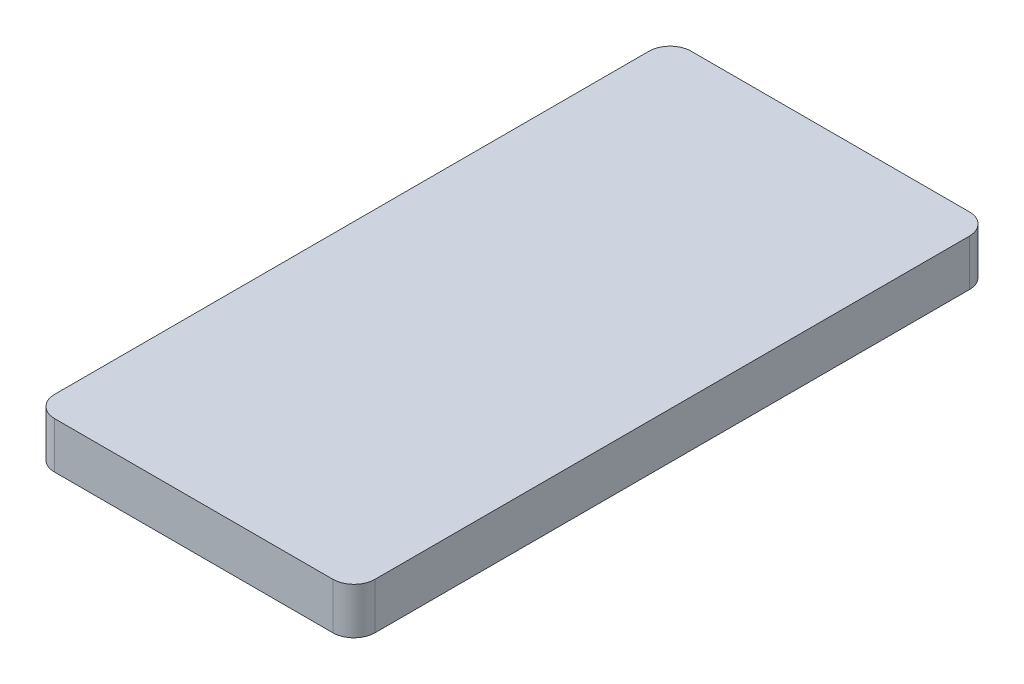
ISO-10303-21;
HEADER;
FILE_DESCRIPTION(('STEP AP214'),'2;1');
FILE_NAME('part.step','',(''),(''),'','','');
FILE_SCHEMA(('AUTOMOTIVE_DESIGN { 1 0 10303 214 1 1 1 1 }'));
ENDSEC;
DATA;
#1=APPLICATION_CONTEXT('core data for automotive mechanical design processes');
#2=APPLICATION_PROTOCOL_DEFINITION('international standard','automotive_design',2000,#1);
#3=PRODUCT_CONTEXT('',#1,'mechanical');
#4=PRODUCT('Part','Part','',(#3));
#5=PRODUCT_RELATED_PRODUCT_CATEGORY('part','',(#4));
#6=PRODUCT_DEFINITION_FORMATION('','',#4);
#7=PRODUCT_DEFINITION_CONTEXT('part definition',#1,'design');
#8=PRODUCT_DEFINITION('design','',#6,#7);
#9=PRODUCT_DEFINITION_SHAPE('','',#8);
#10=(LENGTH_UNIT() NAMED_UNIT(*) SI_UNIT(.MILLI.,.METRE.));
#11=(NAMED_UNIT(*) PLANE_ANGLE_UNIT() SI_UNIT($,.RADIAN.));
#12=(NAMED_UNIT(*) SI_UNIT($,.STERADIAN.) SOLID_ANGLE_UNIT());
#13=UNCERTAINTY_MEASURE_WITH_UNIT(LENGTH_MEASURE(1.E-05),#10,'distance_accuracy_value','');
#14=(GEOMETRIC_REPRESENTATION_CONTEXT(3) GLOBAL_UNCERTAINTY_ASSIGNED_CONTEXT((#13)) GLOBAL_UNIT_ASSIGNED_CONTEXT((#10,
#11,#12)) REPRESENTATION_CONTEXT('',''));
#15=CARTESIAN_POINT('',(0.,0.,0.));
#16=DIRECTION('',(0.,0.,1.));
#17=DIRECTION('',(1.,0.,0.));
#18=AXIS2_PLACEMENT_3D('',#15,#16,#17);
#19=CARTESIAN_POINT('',(38.,11.,-75.5));
#20=DIRECTION('',(-1.,0.,0.));
#21=DIRECTION('',(0.,0.,1.));
#22=AXIS2_PLACEMENT_3D('',#19,#20,#21);
#23=PLANE('',#22);
#24=DIRECTION('',(0.,0.,-1.));
#25=VECTOR('',#24,1.);
#26=CARTESIAN_POINT('',(38.,0.,-75.5));
#27=LINE('',#26,#25);
#28=CARTESIAN_POINT('',(38.,0.,70.5));
#29=VERTEX_POINT('',#28);
#30=CARTESIAN_POINT('',(38.,0.,-70.5));
#31=VERTEX_POINT('',#30);
#32=EDGE_CURVE('E521',#29,#31,#27,.T.);
#33=ORIENTED_EDGE('',*,*,#32,.T.);
#34=DIRECTION('',(0.,-1.,0.));
#35=VECTOR('',#34,1.);
#36=CARTESIAN_POINT('',(38.,11.,-70.5));
#37=LINE('',#36,#35);
#38=CARTESIAN_POINT('',(38.,11.,-70.5));
#39=VERTEX_POINT('',#38);
#40=EDGE_CURVE('E13',#31,#39,#37,.F.);
#41=ORIENTED_EDGE('',*,*,#40,.T.);
#42=DIRECTION('',(0.,0.,-1.));
#43=VECTOR('',#42,1.);
#44=CARTESIAN_POINT('',(38.,11.,-75.5));
#45=LINE('',#44,#43);
#46=CARTESIAN_POINT('',(38.,11.,70.5));
#47=VERTEX_POINT('',#46);
#48=EDGE_CURVE('E538',#47,#39,#45,.T.);
#49=ORIENTED_EDGE('',*,*,#48,.F.);
#50=DIRECTION('',(0.,-1.,0.));
#51=VECTOR('',#50,1.);
#52=CARTESIAN_POINT('',(38.,11.,70.5));
#53=LINE('',#52,#51);
#54=EDGE_CURVE('E366',#47,#29,#53,.T.);
#55=ORIENTED_EDGE('',*,*,#54,.T.);
#56=EDGE_LOOP('',(#33,#41,#49,#55));
#57=FACE_BOUND('',#56,.T.);
#58=ADVANCED_FACE('F358',(#57),#23,.F.);
#59=CARTESIAN_POINT('',(-38.,11.,-75.5));
#60=DIRECTION('',(0.,0.,1.));
#61=DIRECTION('',(1.,0.,0.));
#62=AXIS2_PLACEMENT_3D('',#59,#60,#61);
#63=PLANE('',#62);
#64=DIRECTION('',(-1.,0.,0.));
#65=VECTOR('',#64,1.);
#66=CARTESIAN_POINT('',(-38.,0.,-75.5));
#67=LINE('',#66,#65);
#68=CARTESIAN_POINT('',(33.,0.,-75.5));
#69=VERTEX_POINT('',#68);
#70=CARTESIAN_POINT('',(-33.,0.,-75.5));
#71=VERTEX_POINT('',#70);
#72=EDGE_CURVE('E551',#69,#71,#67,.T.);
#73=ORIENTED_EDGE('',*,*,#72,.T.);
#74=DIRECTION('',(0.,-1.,0.));
#75=VECTOR('',#74,1.);
#76=CARTESIAN_POINT('',(-33.,11.,-75.5));
#77=LINE('',#76,#75);
#78=CARTESIAN_POINT('',(-33.,11.,-75.5));
#79=VERTEX_POINT('',#78);
#80=EDGE_CURVE('E373',#71,#79,#77,.F.);
#81=ORIENTED_EDGE('',*,*,#80,.T.);
#82=DIRECTION('',(-1.,0.,0.));
#83=VECTOR('',#82,1.);
#84=CARTESIAN_POINT('',(-38.,11.,-75.5));
#85=LINE('',#84,#83);
#86=CARTESIAN_POINT('',(33.,11.,-75.5));
#87=VERTEX_POINT('',#86);
#88=EDGE_CURVE('E540',#87,#79,#85,.T.);
#89=ORIENTED_EDGE('',*,*,#88,.F.);
#90=DIRECTION('',(0.,-1.,0.));
#91=VECTOR('',#90,1.);
#92=CARTESIAN_POINT('',(33.,11.,-75.5));
#93=LINE('',#92,#91);
#94=EDGE_CURVE('E604',#87,#69,#93,.T.);
#95=ORIENTED_EDGE('',*,*,#94,.T.);
#96=EDGE_LOOP('',(#73,#81,#89,#95));
#97=FACE_BOUND('',#96,.T.);
#98=ADVANCED_FACE('F622',(#97),#63,.F.);
#99=CARTESIAN_POINT('',(-38.,11.,-75.5));
#100=DIRECTION('',(1.,0.,0.));
#101=DIRECTION('',(0.,0.,-1.));
#102=AXIS2_PLACEMENT_3D('',#99,#100,#101);
#103=PLANE('',#102);
#104=DIRECTION('',(0.,0.,1.));
#105=VECTOR('',#104,1.);
#106=CARTESIAN_POINT('',(-38.,0.,-75.5));
#107=LINE('',#106,#105);
#108=CARTESIAN_POINT('',(-38.,0.,-70.5));
#109=VERTEX_POINT('',#108);
#110=CARTESIAN_POINT('',(-38.,0.,70.5));
#111=VERTEX_POINT('',#110);
#112=EDGE_CURVE('E553',#109,#111,#107,.T.);
#113=ORIENTED_EDGE('',*,*,#112,.T.);
#114=DIRECTION('',(0.,-1.,0.));
#115=VECTOR('',#114,1.);
#116=CARTESIAN_POINT('',(-38.,11.,70.5));
#117=LINE('',#116,#115);
#118=CARTESIAN_POINT('',(-38.,11.,70.5));
#119=VERTEX_POINT('',#118);
#120=EDGE_CURVE('E595',#111,#119,#117,.F.);
#121=ORIENTED_EDGE('',*,*,#120,.T.);
#122=DIRECTION('',(0.,0.,1.));
#123=VECTOR('',#122,1.);
#124=CARTESIAN_POINT('',(-38.,11.,-75.5));
#125=LINE('',#124,#123);
#126=CARTESIAN_POINT('',(-38.,11.,-70.5));
#127=VERTEX_POINT('',#126);
#128=EDGE_CURVE('E543',#127,#119,#125,.T.);
#129=ORIENTED_EDGE('',*,*,#128,.F.);
#130=DIRECTION('',(0.,-1.,0.));
#131=VECTOR('',#130,1.);
#132=CARTESIAN_POINT('',(-38.,11.,-70.5));
#133=LINE('',#132,#131);
#134=EDGE_CURVE('E592',#127,#109,#133,.T.);
#135=ORIENTED_EDGE('',*,*,#134,.T.);
#136=EDGE_LOOP('',(#113,#121,#129,#135));
#137=FACE_BOUND('',#136,.T.);
#138=ADVANCED_FACE('F631',(#137),#103,.F.);
#139=CARTESIAN_POINT('',(-38.,11.,75.5));
#140=DIRECTION('',(0.,0.,-1.));
#141=DIRECTION('',(-1.,0.,0.));
#142=AXIS2_PLACEMENT_3D('',#139,#140,#141);
#143=PLANE('',#142);
#144=DIRECTION('',(1.,0.,0.));
#145=VECTOR('',#144,1.);
#146=CARTESIAN_POINT('',(-38.,11.,75.5));
#147=LINE('',#146,#145);
#148=CARTESIAN_POINT('',(-33.,11.,75.5));
#149=VERTEX_POINT('',#148);
#150=CARTESIAN_POINT('',(33.,11.,75.5));
#151=VERTEX_POINT('',#150);
#152=EDGE_CURVE('E546',#149,#151,#147,.T.);
#153=ORIENTED_EDGE('',*,*,#152,.F.);
#154=DIRECTION('',(0.,-1.,0.));
#155=VECTOR('',#154,1.);
#156=CARTESIAN_POINT('',(-33.,11.,75.5));
#157=LINE('',#156,#155);
#158=CARTESIAN_POINT('',(-33.,0.,75.5));
#159=VERTEX_POINT('',#158);
#160=EDGE_CURVE('E581',#149,#159,#157,.T.);
#161=ORIENTED_EDGE('',*,*,#160,.T.);
#162=DIRECTION('',(1.,0.,0.));
#163=VECTOR('',#162,1.);
#164=CARTESIAN_POINT('',(-38.,0.,75.5));
#165=LINE('',#164,#163);
#166=CARTESIAN_POINT('',(33.,0.,75.5));
#167=VERTEX_POINT('',#166);
#168=EDGE_CURVE('E541',#159,#167,#165,.T.);
#169=ORIENTED_EDGE('',*,*,#168,.T.);
#170=DIRECTION('',(0.,-1.,0.));
#171=VECTOR('',#170,1.);
#172=CARTESIAN_POINT('',(33.,11.,75.5));
#173=LINE('',#172,#171);
#174=EDGE_CURVE('E579',#167,#151,#173,.F.);
#175=ORIENTED_EDGE('',*,*,#174,.T.);
#176=EDGE_LOOP('',(#153,#161,#169,#175));
#177=FACE_BOUND('',#176,.T.);
#178=ADVANCED_FACE('F639',(#177),#143,.F.);
#179=CARTESIAN_POINT('',(0.,11.,0.));
#180=DIRECTION('',(0.,1.,0.));
#181=DIRECTION('',(0.,0.,1.));
#182=AXIS2_PLACEMENT_3D('',#179,#180,#181);
#183=PLANE('',#182);
#184=ORIENTED_EDGE('',*,*,#128,.T.);
#185=CARTESIAN_POINT('',(-33.,11.,70.5));
#186=DIRECTION('',(0.,1.,0.));
#187=DIRECTION('',(0.,0.,1.));
#188=AXIS2_PLACEMENT_3D('',#185,#186,#187);
#189=CIRCLE('',#188,5.);
#190=EDGE_CURVE('E602',#119,#149,#189,.T.);
#191=ORIENTED_EDGE('',*,*,#190,.T.);
#192=ORIENTED_EDGE('',*,*,#152,.T.);
#193=CARTESIAN_POINT('',(33.,11.,70.5));
#194=DIRECTION('',(0.,1.,0.));
#195=DIRECTION('',(0.,0.,1.));
#196=AXIS2_PLACEMENT_3D('',#193,#194,#195);
#197=CIRCLE('',#196,5.);
#198=EDGE_CURVE('E597',#151,#47,#197,.T.);
#199=ORIENTED_EDGE('',*,*,#198,.T.);
#200=ORIENTED_EDGE('',*,*,#48,.T.);
#201=CARTESIAN_POINT('',(33.,11.,-70.5));
#202=DIRECTION('',(0.,1.,0.));
#203=DIRECTION('',(0.,0.,1.));
#204=AXIS2_PLACEMENT_3D('',#201,#202,#203);
#205=CIRCLE('',#204,5.);
#206=EDGE_CURVE('E380',#39,#87,#205,.T.);
#207=ORIENTED_EDGE('',*,*,#206,.T.);
#208=ORIENTED_EDGE('',*,*,#88,.T.);
#209=CARTESIAN_POINT('',(-33.,11.,-70.5));
#210=DIRECTION('',(0.,1.,0.));
#211=DIRECTION('',(0.,0.,1.));
#212=AXIS2_PLACEMENT_3D('',#209,#210,#211);
#213=CIRCLE('',#212,5.);
#214=EDGE_CURVE('E600',#79,#127,#213,.T.);
#215=ORIENTED_EDGE('',*,*,#214,.T.);
#216=EDGE_LOOP('',(#184,#191,#192,#199,#200,#207,#208,#215));
#217=FACE_BOUND('',#216,.T.);
#218=ADVANCED_FACE('F624',(#217),#183,.T.);
#219=CARTESIAN_POINT('',(0.,0.,0.));
#220=DIRECTION('',(0.,1.,0.));
#221=DIRECTION('',(0.,0.,1.));
#222=AXIS2_PLACEMENT_3D('',#219,#220,#221);
#223=PLANE('',#222);
#224=CARTESIAN_POINT('',(0.,0.,0.));
#225=DIRECTION('',(0.,-1.,0.));
#226=DIRECTION('',(0.,0.,1.));
#227=AXIS2_PLACEMENT_3D('',#224,#225,#226);
#228=CIRCLE('',#227,1.);
#229=CARTESIAN_POINT('',(0.,0.,1.));
#230=VERTEX_POINT('',#229);
#231=EDGE_CURVE('E502',#230,#230,#228,.T.);
#232=ORIENTED_EDGE('',*,*,#231,.F.);
#233=EDGE_LOOP('',(#232));
#234=FACE_BOUND('',#233,.T.);
#235=DIRECTION('',(1.,0.,0.));
#236=VECTOR('',#235,1.);
#237=CARTESIAN_POINT('',(0.,0.,74.5));
#238=LINE('',#237,#236);
#239=CARTESIAN_POINT('',(10.1458434959374,0.,74.5));
#240=VERTEX_POINT('',#239);
#241=CARTESIAN_POINT('',(24.8541565040626,0.,74.5));
#242=VERTEX_POINT('',#241);
#243=EDGE_CURVE('E574',#240,#242,#238,.T.);
#244=ORIENTED_EDGE('',*,*,#243,.T.);
#245=CARTESIAN_POINT('',(24.8541565040626,0.,62.3541565040626));
#246=DIRECTION('',(0.,1.,0.));
#247=DIRECTION('',(0.,0.,1.));
#248=AXIS2_PLACEMENT_3D('',#245,#246,#247);
#249=CIRCLE('',#248,12.1458434959374);
#250=CARTESIAN_POINT('',(37.,0.,62.3541565040626));
#251=VERTEX_POINT('',#250);
#252=EDGE_CURVE('E577',#242,#251,#249,.T.);
#253=ORIENTED_EDGE('',*,*,#252,.T.);
#254=DIRECTION('',(0.,0.,-1.));
#255=VECTOR('',#254,1.);
#256=CARTESIAN_POINT('',(37.,0.,0.));
#257=LINE('',#256,#255);
#258=CARTESIAN_POINT('',(37.,0.,47.3541565040626));
#259=VERTEX_POINT('',#258);
#260=EDGE_CURVE('E477',#251,#259,#257,.T.);
#261=ORIENTED_EDGE('',*,*,#260,.T.);
#262=CARTESIAN_POINT('',(24.8541565040626,0.,47.3541565040626));
#263=DIRECTION('',(0.,1.,0.));
#264=DIRECTION('',(0.,0.,1.));
#265=AXIS2_PLACEMENT_3D('',#262,#263,#264);
#266=CIRCLE('',#265,12.1458434959374);
#267=CARTESIAN_POINT('',(27.5,0.,35.5));
#268=VERTEX_POINT('',#267);
#269=EDGE_CURVE('E559',#259,#268,#266,.T.);
#270=ORIENTED_EDGE('',*,*,#269,.T.);
#271=DIRECTION('',(-1.,0.,0.));
#272=VECTOR('',#271,1.);
#273=CARTESIAN_POINT('',(0.,0.,35.5));
#274=LINE('',#273,#272);
#275=CARTESIAN_POINT('',(7.49999999999999,0.,35.5));
#276=VERTEX_POINT('',#275);
#277=EDGE_CURVE('E562',#268,#276,#274,.T.);
#278=ORIENTED_EDGE('',*,*,#277,.T.);
#279=CARTESIAN_POINT('',(10.1458434959374,0.,47.3541565040626));
#280=DIRECTION('',(0.,1.,0.));
#281=DIRECTION('',(0.,0.,1.));
#282=AXIS2_PLACEMENT_3D('',#279,#280,#281);
#283=CIRCLE('',#282,12.1458434959374);
#284=CARTESIAN_POINT('',(-2.00000000000001,0.,47.3541565040626));
#285=VERTEX_POINT('',#284);
#286=EDGE_CURVE('E565',#276,#285,#283,.T.);
#287=ORIENTED_EDGE('',*,*,#286,.T.);
#288=DIRECTION('',(0.,0.,1.));
#289=VECTOR('',#288,1.);
#290=CARTESIAN_POINT('',(-2.00000000000001,0.,0.));
#291=LINE('',#290,#289);
#292=CARTESIAN_POINT('',(-2.00000000000001,0.,62.3541565040626));
#293=VERTEX_POINT('',#292);
#294=EDGE_CURVE('E568',#285,#293,#291,.T.);
#295=ORIENTED_EDGE('',*,*,#294,.T.);
#296=CARTESIAN_POINT('',(10.1458434959374,0.,62.3541565040626));
#297=DIRECTION('',(0.,1.,0.));
#298=DIRECTION('',(0.,0.,1.));
#299=AXIS2_PLACEMENT_3D('',#296,#297,#298);
#300=CIRCLE('',#299,12.1458434959374);
#301=EDGE_CURVE('E571',#293,#240,#300,.T.);
#302=ORIENTED_EDGE('',*,*,#301,.T.);
#303=EDGE_LOOP('',(#244,#253,#261,#270,#278,#287,#295,#302));
#304=FACE_BOUND('',#303,.T.);
#305=ORIENTED_EDGE('',*,*,#168,.F.);
#306=CARTESIAN_POINT('',(-33.,0.,70.5));
#307=DIRECTION('',(0.,1.,0.));
#308=DIRECTION('',(0.,0.,1.));
#309=AXIS2_PLACEMENT_3D('',#306,#307,#308);
#310=CIRCLE('',#309,5.);
#311=EDGE_CURVE('E590',#159,#111,#310,.F.);
#312=ORIENTED_EDGE('',*,*,#311,.T.);
#313=ORIENTED_EDGE('',*,*,#112,.F.);
#314=CARTESIAN_POINT('',(-33.,0.,-70.5));
#315=DIRECTION('',(0.,1.,0.));
#316=DIRECTION('',(0.,0.,1.));
#317=AXIS2_PLACEMENT_3D('',#314,#315,#316);
#318=CIRCLE('',#317,5.);
#319=EDGE_CURVE('E588',#109,#71,#318,.F.);
#320=ORIENTED_EDGE('',*,*,#319,.T.);
#321=ORIENTED_EDGE('',*,*,#72,.F.);
#322=CARTESIAN_POINT('',(33.,0.,-70.5));
#323=DIRECTION('',(0.,1.,0.));
#324=DIRECTION('',(0.,0.,1.));
#325=AXIS2_PLACEMENT_3D('',#322,#323,#324);
#326=CIRCLE('',#325,5.);
#327=EDGE_CURVE('E586',#69,#31,#326,.F.);
#328=ORIENTED_EDGE('',*,*,#327,.T.);
#329=ORIENTED_EDGE('',*,*,#32,.F.);
#330=CARTESIAN_POINT('',(33.,0.,70.5));
#331=DIRECTION('',(0.,1.,0.));
#332=DIRECTION('',(0.,0.,1.));
#333=AXIS2_PLACEMENT_3D('',#330,#331,#332);
#334=CIRCLE('',#333,5.);
#335=EDGE_CURVE('E584',#29,#167,#334,.F.);
#336=ORIENTED_EDGE('',*,*,#335,.T.);
#337=EDGE_LOOP('',(#305,#312,#313,#320,#321,#328,#329,#336));
#338=FACE_BOUND('',#337,.T.);
#339=ADVANCED_FACE('F617',(#234,#304,#338),#223,.F.);
#340=CARTESIAN_POINT('',(24.8541565040626,-1.,62.3541565040626));
#341=DIRECTION('',(0.,1.,0.));
#342=DIRECTION('',(0.,0.,1.));
#343=AXIS2_PLACEMENT_3D('',#340,#341,#342);
#344=CYLINDRICAL_SURFACE('',#343,12.1458434959374);
#345=ORIENTED_EDGE('',*,*,#252,.F.);
#346=DIRECTION('',(0.,1.,0.));
#347=VECTOR('',#346,1.);
#348=CARTESIAN_POINT('',(24.8541565040626,-1.,74.5));
#349=LINE('',#348,#347);
#350=CARTESIAN_POINT('',(24.8541565040626,-1.,74.5));
#351=VERTEX_POINT('',#350);
#352=EDGE_CURVE('E497',#351,#242,#349,.T.);
#353=ORIENTED_EDGE('',*,*,#352,.F.);
#354=CARTESIAN_POINT('',(24.8541565040626,-1.,62.3541565040626));
#355=DIRECTION('',(0.,1.,0.));
#356=DIRECTION('',(0.,0.,1.));
#357=AXIS2_PLACEMENT_3D('',#354,#355,#356);
#358=CIRCLE('',#357,12.1458434959374);
#359=CARTESIAN_POINT('',(37.,-1.,62.3541565040626));
#360=VERTEX_POINT('',#359);
#361=EDGE_CURVE('E489',#351,#360,#358,.T.);
#362=ORIENTED_EDGE('',*,*,#361,.T.);
#363=DIRECTION('',(0.,1.,0.));
#364=VECTOR('',#363,1.);
#365=CARTESIAN_POINT('',(37.,-1.,62.3541565040626));
#366=LINE('',#365,#364);
#367=EDGE_CURVE('E472',#360,#251,#366,.T.);
#368=ORIENTED_EDGE('',*,*,#367,.T.);
#369=EDGE_LOOP('',(#345,#353,#362,#368));
#370=FACE_BOUND('',#369,.T.);
#371=ADVANCED_FACE('F495',(#370),#344,.T.);
#372=CARTESIAN_POINT('',(0.,-1.,74.5));
#373=DIRECTION('',(0.,0.,1.));
#374=DIRECTION('',(1.,0.,0.));
#375=AXIS2_PLACEMENT_3D('',#372,#373,#374);
#376=PLANE('',#375);
#377=ORIENTED_EDGE('',*,*,#243,.F.);
#378=DIRECTION('',(0.,1.,0.));
#379=VECTOR('',#378,1.);
#380=CARTESIAN_POINT('',(10.1458434959374,-1.,74.5));
#381=LINE('',#380,#379);
#382=CARTESIAN_POINT('',(10.1458434959374,-1.,74.5));
#383=VERTEX_POINT('',#382);
#384=EDGE_CURVE('E522',#383,#240,#381,.T.);
#385=ORIENTED_EDGE('',*,*,#384,.F.);
#386=DIRECTION('',(1.,0.,0.));
#387=VECTOR('',#386,1.);
#388=CARTESIAN_POINT('',(0.,-1.,74.5));
#389=LINE('',#388,#387);
#390=EDGE_CURVE('E482',#383,#351,#389,.T.);
#391=ORIENTED_EDGE('',*,*,#390,.T.);
#392=ORIENTED_EDGE('',*,*,#352,.T.);
#393=EDGE_LOOP('',(#377,#385,#391,#392));
#394=FACE_BOUND('',#393,.T.);
#395=ADVANCED_FACE('F708',(#394),#376,.T.);
#396=CARTESIAN_POINT('',(10.1458434959374,-1.,62.3541565040626));
#397=DIRECTION('',(0.,1.,0.));
#398=DIRECTION('',(0.,0.,1.));
#399=AXIS2_PLACEMENT_3D('',#396,#397,#398);
#400=CYLINDRICAL_SURFACE('',#399,12.1458434959374);
#401=ORIENTED_EDGE('',*,*,#301,.F.);
#402=DIRECTION('',(0.,1.,0.));
#403=VECTOR('',#402,1.);
#404=CARTESIAN_POINT('',(-2.00000000000001,-1.,62.3541565040626));
#405=LINE('',#404,#403);
#406=CARTESIAN_POINT('',(-2.00000000000001,-1.,62.3541565040626));
#407=VERTEX_POINT('',#406);
#408=EDGE_CURVE('E525',#407,#293,#405,.T.);
#409=ORIENTED_EDGE('',*,*,#408,.F.);
#410=CARTESIAN_POINT('',(10.1458434959374,-1.,62.3541565040626));
#411=DIRECTION('',(0.,1.,0.));
#412=DIRECTION('',(0.,0.,1.));
#413=AXIS2_PLACEMENT_3D('',#410,#411,#412);
#414=CIRCLE('',#413,12.1458434959374);
#415=EDGE_CURVE('E516',#407,#383,#414,.T.);
#416=ORIENTED_EDGE('',*,*,#415,.T.);
#417=ORIENTED_EDGE('',*,*,#384,.T.);
#418=EDGE_LOOP('',(#401,#409,#416,#417));
#419=FACE_BOUND('',#418,.T.);
#420=ADVANCED_FACE('F711',(#419),#400,.T.);
#421=CARTESIAN_POINT('',(-2.00000000000001,-1.,0.));
#422=DIRECTION('',(-1.,0.,0.));
#423=DIRECTION('',(0.,0.,1.));
#424=AXIS2_PLACEMENT_3D('',#421,#422,#423);
#425=PLANE('',#424);
#426=ORIENTED_EDGE('',*,*,#294,.F.);
#427=DIRECTION('',(0.,1.,0.));
#428=VECTOR('',#427,1.);
#429=CARTESIAN_POINT('',(-2.00000000000001,-1.,47.3541565040626));
#430=LINE('',#429,#428);
#431=CARTESIAN_POINT('',(-2.00000000000001,-1.,47.3541565040626));
#432=VERTEX_POINT('',#431);
#433=EDGE_CURVE('E528',#432,#285,#430,.T.);
#434=ORIENTED_EDGE('',*,*,#433,.F.);
#435=DIRECTION('',(0.,0.,1.));
#436=VECTOR('',#435,1.);
#437=CARTESIAN_POINT('',(-2.00000000000001,-1.,0.));
#438=LINE('',#437,#436);
#439=EDGE_CURVE('E513',#432,#407,#438,.T.);
#440=ORIENTED_EDGE('',*,*,#439,.T.);
#441=ORIENTED_EDGE('',*,*,#408,.T.);
#442=EDGE_LOOP('',(#426,#434,#440,#441));
#443=FACE_BOUND('',#442,.T.);
#444=ADVANCED_FACE('F715',(#443),#425,.T.);
#445=CARTESIAN_POINT('',(10.1458434959374,-1.,47.3541565040626));
#446=DIRECTION('',(0.,1.,0.));
#447=DIRECTION('',(0.,0.,1.));
#448=AXIS2_PLACEMENT_3D('',#445,#446,#447);
#449=CYLINDRICAL_SURFACE('',#448,12.1458434959374);
#450=ORIENTED_EDGE('',*,*,#286,.F.);
#451=DIRECTION('',(0.,1.,0.));
#452=VECTOR('',#451,1.);
#453=CARTESIAN_POINT('',(7.49999999999999,-1.,35.5));
#454=LINE('',#453,#452);
#455=CARTESIAN_POINT('',(7.49999999999999,-1.,35.5));
#456=VERTEX_POINT('',#455);
#457=EDGE_CURVE('E531',#456,#276,#454,.T.);
#458=ORIENTED_EDGE('',*,*,#457,.F.);
#459=CARTESIAN_POINT('',(10.1458434959374,-1.,47.3541565040626));
#460=DIRECTION('',(0.,1.,0.));
#461=DIRECTION('',(0.,0.,1.));
#462=AXIS2_PLACEMENT_3D('',#459,#460,#461);
#463=CIRCLE('',#462,12.1458434959374);
#464=EDGE_CURVE('E510',#456,#432,#463,.T.);
#465=ORIENTED_EDGE('',*,*,#464,.T.);
#466=ORIENTED_EDGE('',*,*,#433,.T.);
#467=EDGE_LOOP('',(#450,#458,#465,#466));
#468=FACE_BOUND('',#467,.T.);
#469=ADVANCED_FACE('F719',(#468),#449,.T.);
#470=CARTESIAN_POINT('',(0.,-1.,35.5));
#471=DIRECTION('',(0.,0.,-1.));
#472=DIRECTION('',(-1.,0.,0.));
#473=AXIS2_PLACEMENT_3D('',#470,#471,#472);
#474=PLANE('',#473);
#475=ORIENTED_EDGE('',*,*,#277,.F.);
#476=DIRECTION('',(0.,1.,0.));
#477=VECTOR('',#476,1.);
#478=CARTESIAN_POINT('',(27.5,-1.,35.5));
#479=LINE('',#478,#477);
#480=CARTESIAN_POINT('',(27.5,-1.,35.5));
#481=VERTEX_POINT('',#480);
#482=EDGE_CURVE('E534',#481,#268,#479,.T.);
#483=ORIENTED_EDGE('',*,*,#482,.F.);
#484=DIRECTION('',(-1.,0.,0.));
#485=VECTOR('',#484,1.);
#486=CARTESIAN_POINT('',(0.,-1.,35.5));
#487=LINE('',#486,#485);
#488=EDGE_CURVE('E507',#481,#456,#487,.T.);
#489=ORIENTED_EDGE('',*,*,#488,.T.);
#490=ORIENTED_EDGE('',*,*,#457,.T.);
#491=EDGE_LOOP('',(#475,#483,#489,#490));
#492=FACE_BOUND('',#491,.T.);
#493=ADVANCED_FACE('F723',(#492),#474,.T.);
#494=CARTESIAN_POINT('',(24.8541565040626,-1.,47.3541565040626));
#495=DIRECTION('',(0.,1.,0.));
#496=DIRECTION('',(0.,0.,1.));
#497=AXIS2_PLACEMENT_3D('',#494,#495,#496);
#498=CYLINDRICAL_SURFACE('',#497,12.1458434959374);
#499=ORIENTED_EDGE('',*,*,#269,.F.);
#500=DIRECTION('',(0.,1.,0.));
#501=VECTOR('',#500,1.);
#502=CARTESIAN_POINT('',(37.,-1.,47.3541565040626));
#503=LINE('',#502,#501);
#504=CARTESIAN_POINT('',(37.,-1.,47.3541565040626));
#505=VERTEX_POINT('',#504);
#506=EDGE_CURVE('E481',#505,#259,#503,.T.);
#507=ORIENTED_EDGE('',*,*,#506,.F.);
#508=CARTESIAN_POINT('',(24.8541565040626,-1.,47.3541565040626));
#509=DIRECTION('',(0.,1.,0.));
#510=DIRECTION('',(0.,0.,1.));
#511=AXIS2_PLACEMENT_3D('',#508,#509,#510);
#512=CIRCLE('',#511,12.1458434959374);
#513=EDGE_CURVE('E493',#505,#481,#512,.T.);
#514=ORIENTED_EDGE('',*,*,#513,.T.);
#515=ORIENTED_EDGE('',*,*,#482,.T.);
#516=EDGE_LOOP('',(#499,#507,#514,#515));
#517=FACE_BOUND('',#516,.T.);
#518=ADVANCED_FACE('F727',(#517),#498,.T.);
#519=CARTESIAN_POINT('',(37.,-1.,0.));
#520=DIRECTION('',(1.,0.,0.));
#521=DIRECTION('',(0.,0.,-1.));
#522=AXIS2_PLACEMENT_3D('',#519,#520,#521);
#523=PLANE('',#522);
#524=ORIENTED_EDGE('',*,*,#260,.F.);
#525=ORIENTED_EDGE('',*,*,#367,.F.);
#526=DIRECTION('',(0.,0.,-1.));
#527=VECTOR('',#526,1.);
#528=CARTESIAN_POINT('',(37.,-1.,0.));
#529=LINE('',#528,#527);
#530=EDGE_CURVE('E475',#360,#505,#529,.T.);
#531=ORIENTED_EDGE('',*,*,#530,.T.);
#532=ORIENTED_EDGE('',*,*,#506,.T.);
#533=EDGE_LOOP('',(#524,#525,#531,#532));
#534=FACE_BOUND('',#533,.T.);
#535=ADVANCED_FACE('F474',(#534),#523,.T.);
#536=CARTESIAN_POINT('',(24.8541565040626,-1.,62.3541565040626));
#537=DIRECTION('',(0.,1.,0.));
#538=DIRECTION('',(0.,0.,1.));
#539=AXIS2_PLACEMENT_3D('',#536,#537,#538);
#540=PLANE('',#539);
#541=ORIENTED_EDGE('',*,*,#361,.F.);
#542=ORIENTED_EDGE('',*,*,#390,.F.);
#543=ORIENTED_EDGE('',*,*,#415,.F.);
#544=ORIENTED_EDGE('',*,*,#439,.F.);
#545=ORIENTED_EDGE('',*,*,#464,.F.);
#546=ORIENTED_EDGE('',*,*,#488,.F.);
#547=ORIENTED_EDGE('',*,*,#513,.F.);
#548=ORIENTED_EDGE('',*,*,#530,.F.);
#549=EDGE_LOOP('',(#541,#542,#543,#544,#545,#546,#547,#548));
#550=FACE_BOUND('',#549,.T.);
#551=ADVANCED_FACE('F487',(#550),#540,.F.);
#552=CARTESIAN_POINT('',(-33.,11.,70.5));
#553=DIRECTION('',(0.,-1.,0.));
#554=DIRECTION('',(0.,0.,-1.));
#555=AXIS2_PLACEMENT_3D('',#552,#553,#554);
#556=CYLINDRICAL_SURFACE('',#555,5.);
#557=ORIENTED_EDGE('',*,*,#190,.F.);
#558=ORIENTED_EDGE('',*,*,#120,.F.);
#559=ORIENTED_EDGE('',*,*,#311,.F.);
#560=ORIENTED_EDGE('',*,*,#160,.F.);
#561=EDGE_LOOP('',(#557,#558,#559,#560));
#562=FACE_BOUND('',#561,.T.);
#563=ADVANCED_FACE('F636',(#562),#556,.T.);
#564=CARTESIAN_POINT('',(-33.,11.,-70.5));
#565=DIRECTION('',(0.,-1.,0.));
#566=DIRECTION('',(0.,0.,-1.));
#567=AXIS2_PLACEMENT_3D('',#564,#565,#566);
#568=CYLINDRICAL_SURFACE('',#567,5.);
#569=ORIENTED_EDGE('',*,*,#214,.F.);
#570=ORIENTED_EDGE('',*,*,#80,.F.);
#571=ORIENTED_EDGE('',*,*,#319,.F.);
#572=ORIENTED_EDGE('',*,*,#134,.F.);
#573=EDGE_LOOP('',(#569,#570,#571,#572));
#574=FACE_BOUND('',#573,.T.);
#575=ADVANCED_FACE('F628',(#574),#568,.T.);
#576=CARTESIAN_POINT('',(33.,11.,-70.5));
#577=DIRECTION('',(0.,-1.,0.));
#578=DIRECTION('',(0.,0.,-1.));
#579=AXIS2_PLACEMENT_3D('',#576,#577,#578);
#580=CYLINDRICAL_SURFACE('',#579,5.);
#581=ORIENTED_EDGE('',*,*,#206,.F.);
#582=ORIENTED_EDGE('',*,*,#40,.F.);
#583=ORIENTED_EDGE('',*,*,#327,.F.);
#584=ORIENTED_EDGE('',*,*,#94,.F.);
#585=EDGE_LOOP('',(#581,#582,#583,#584));
#586=FACE_BOUND('',#585,.T.);
#587=ADVANCED_FACE('F621',(#586),#580,.T.);
#588=CARTESIAN_POINT('',(33.,11.,70.5));
#589=DIRECTION('',(0.,-1.,0.));
#590=DIRECTION('',(0.,0.,-1.));
#591=AXIS2_PLACEMENT_3D('',#588,#589,#590);
#592=CYLINDRICAL_SURFACE('',#591,5.);
#593=ORIENTED_EDGE('',*,*,#198,.F.);
#594=ORIENTED_EDGE('',*,*,#174,.F.);
#595=ORIENTED_EDGE('',*,*,#335,.F.);
#596=ORIENTED_EDGE('',*,*,#54,.F.);
#597=EDGE_LOOP('',(#593,#594,#595,#596));
#598=FACE_BOUND('',#597,.T.);
#599=ADVANCED_FACE('F360',(#598),#592,.T.);
#600=CARTESIAN_POINT('',(0.,0.,0.));
#601=DIRECTION('',(0.,1.,0.));
#602=DIRECTION('',(0.,0.,1.));
#603=AXIS2_PLACEMENT_3D('',#600,#601,#602);
#604=CYLINDRICAL_SURFACE('',#603,1.);
#605=CARTESIAN_POINT('',(0.,-0.01,0.));
#606=DIRECTION('',(0.,-1.,0.));
#607=DIRECTION('',(0.,0.,-1.));
#608=AXIS2_PLACEMENT_3D('',#605,#606,#607);
#609=CIRCLE('',#608,1.);
#610=CARTESIAN_POINT('',(0.,-0.01,-1.));
#611=VERTEX_POINT('',#610);
#612=EDGE_CURVE('E498',#611,#611,#609,.T.);
#613=ORIENTED_EDGE('',*,*,#612,.F.);
#614=EDGE_LOOP('',(#613));
#615=FACE_BOUND('',#614,.T.);
#616=ORIENTED_EDGE('',*,*,#231,.T.);
#617=EDGE_LOOP('',(#616));
#618=FACE_BOUND('',#617,.T.);
#619=ADVANCED_FACE('F642',(#615,#618),#604,.T.);
#620=CARTESIAN_POINT('',(0.,-0.01,0.));
#621=DIRECTION('',(0.,1.,0.));
#622=DIRECTION('',(0.,0.,1.));
#623=AXIS2_PLACEMENT_3D('',#620,#621,#622);
#624=PLANE('',#623);
#625=ORIENTED_EDGE('',*,*,#612,.T.);
#626=EDGE_LOOP('',(#625));
#627=FACE_BOUND('',#626,.T.);
#628=ADVANCED_FACE('F647',(#627),#624,.F.);
#629=CLOSED_SHELL('',(#58,#98,#138,#178,#218,#339,#371,#395,#420,#444,#469,#493,#518,#535,#551,
#563,#575,#587,#599,#619,#628));
#630=MANIFOLD_SOLID_BREP('B2',#629);
#631=ADVANCED_BREP_SHAPE_REPRESENTATION('',(#18,#630),#14);
#632=SHAPE_DEFINITION_REPRESENTATION(#9,#631);
ENDSEC;
END-ISO-10303-21;
